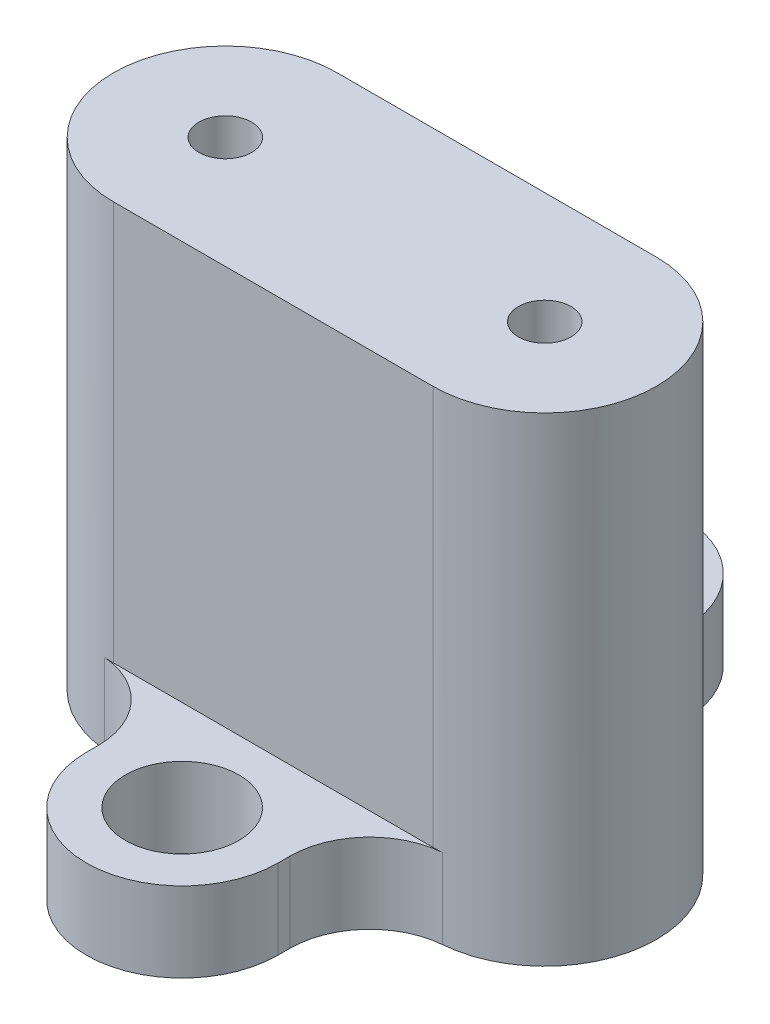
ISO-10303-21;
HEADER;
FILE_DESCRIPTION(('STEP AP214'),'2;1');
FILE_NAME('part.step','',(''),(''),'','','');
FILE_SCHEMA(('AUTOMOTIVE_DESIGN { 1 0 10303 214 1 1 1 1 }'));
ENDSEC;
DATA;
#1=APPLICATION_CONTEXT('core data for automotive mechanical design processes');
#2=APPLICATION_PROTOCOL_DEFINITION('international standard','automotive_design',2000,#1);
#3=PRODUCT_CONTEXT('',#1,'mechanical');
#4=PRODUCT('Part','Part','',(#3));
#5=PRODUCT_RELATED_PRODUCT_CATEGORY('part','',(#4));
#6=PRODUCT_DEFINITION_FORMATION('','',#4);
#7=PRODUCT_DEFINITION_CONTEXT('part definition',#1,'design');
#8=PRODUCT_DEFINITION('design','',#6,#7);
#9=PRODUCT_DEFINITION_SHAPE('','',#8);
#10=(LENGTH_UNIT() NAMED_UNIT(*) SI_UNIT(.MILLI.,.METRE.));
#11=(NAMED_UNIT(*) PLANE_ANGLE_UNIT() SI_UNIT($,.RADIAN.));
#12=(NAMED_UNIT(*) SI_UNIT($,.STERADIAN.) SOLID_ANGLE_UNIT());
#13=UNCERTAINTY_MEASURE_WITH_UNIT(LENGTH_MEASURE(1.E-05),#10,'distance_accuracy_value','');
#14=(GEOMETRIC_REPRESENTATION_CONTEXT(3) GLOBAL_UNCERTAINTY_ASSIGNED_CONTEXT((#13)) GLOBAL_UNIT_ASSIGNED_CONTEXT((#10,
#11,#12)) REPRESENTATION_CONTEXT('',''));
#15=CARTESIAN_POINT('',(0.,0.,0.));
#16=DIRECTION('',(0.,0.,1.));
#17=DIRECTION('',(1.,0.,0.));
#18=AXIS2_PLACEMENT_3D('',#15,#16,#17);
#19=CARTESIAN_POINT('',(-10.,30.,0.));
#20=DIRECTION('',(0.,-1.,0.));
#21=DIRECTION('',(0.,0.,-1.));
#22=AXIS2_PLACEMENT_3D('',#19,#20,#21);
#23=CYLINDRICAL_SURFACE('',#22,7.);
#24=CARTESIAN_POINT('',(-10.,5.,0.));
#25=DIRECTION('',(0.,-1.,0.));
#26=DIRECTION('',(0.,0.,-1.));
#27=AXIS2_PLACEMENT_3D('',#24,#25,#26);
#28=CIRCLE('',#27,7.);
#29=CARTESIAN_POINT('',(-10.,5.,-7.));
#30=VERTEX_POINT('',#29);
#31=CARTESIAN_POINT('',(-10.5833333333333,5.,-6.97565210014248));
#32=VERTEX_POINT('',#31);
#33=EDGE_CURVE('E295',#30,#32,#28,.F.);
#34=ORIENTED_EDGE('',*,*,#33,.T.);
#35=DIRECTION('',(0.,-1.,0.));
#36=VECTOR('',#35,1.);
#37=CARTESIAN_POINT('',(-10.5833333333333,30.,-6.97565210014248));
#38=LINE('',#37,#36);
#39=CARTESIAN_POINT('',(-10.5833333333333,0.,-6.97565210014248));
#40=VERTEX_POINT('',#39);
#41=EDGE_CURVE('E299',#32,#40,#38,.T.);
#42=ORIENTED_EDGE('',*,*,#41,.T.);
#43=CARTESIAN_POINT('',(-10.,0.,0.));
#44=DIRECTION('',(0.,1.,0.));
#45=DIRECTION('',(0.,0.,1.));
#46=AXIS2_PLACEMENT_3D('',#43,#44,#45);
#47=CIRCLE('',#46,7.);
#48=CARTESIAN_POINT('',(-10.5833333333333,0.,6.97565210014248));
#49=VERTEX_POINT('',#48);
#50=EDGE_CURVE('E250',#40,#49,#47,.T.);
#51=ORIENTED_EDGE('',*,*,#50,.T.);
#52=DIRECTION('',(0.,-1.,0.));
#53=VECTOR('',#52,1.);
#54=CARTESIAN_POINT('',(-10.5833333333333,30.,6.97565210014248));
#55=LINE('',#54,#53);
#56=CARTESIAN_POINT('',(-10.5833333333333,5.,6.97565210014248));
#57=VERTEX_POINT('',#56);
#58=EDGE_CURVE('E291',#49,#57,#55,.F.);
#59=ORIENTED_EDGE('',*,*,#58,.T.);
#60=CARTESIAN_POINT('',(-10.,5.,0.));
#61=DIRECTION('',(0.,-1.,0.));
#62=DIRECTION('',(0.,0.,-1.));
#63=AXIS2_PLACEMENT_3D('',#60,#61,#62);
#64=CIRCLE('',#63,7.);
#65=CARTESIAN_POINT('',(-10.,5.,7.));
#66=VERTEX_POINT('',#65);
#67=EDGE_CURVE('E287',#57,#66,#64,.F.);
#68=ORIENTED_EDGE('',*,*,#67,.T.);
#69=DIRECTION('',(0.,-1.,0.));
#70=VECTOR('',#69,1.);
#71=CARTESIAN_POINT('',(-10.,30.,7.));
#72=LINE('',#71,#70);
#73=CARTESIAN_POINT('',(-10.,30.,7.));
#74=VERTEX_POINT('',#73);
#75=EDGE_CURVE('E282',#74,#66,#72,.T.);
#76=ORIENTED_EDGE('',*,*,#75,.F.);
#77=CARTESIAN_POINT('',(-10.,30.,0.));
#78=DIRECTION('',(0.,1.,0.));
#79=DIRECTION('',(0.,0.,1.));
#80=AXIS2_PLACEMENT_3D('',#77,#78,#79);
#81=CIRCLE('',#80,7.);
#82=CARTESIAN_POINT('',(-10.,30.,-7.));
#83=VERTEX_POINT('',#82);
#84=EDGE_CURVE('E251',#83,#74,#81,.T.);
#85=ORIENTED_EDGE('',*,*,#84,.F.);
#86=DIRECTION('',(0.,-1.,0.));
#87=VECTOR('',#86,1.);
#88=CARTESIAN_POINT('',(-10.,30.,-7.));
#89=LINE('',#88,#87);
#90=EDGE_CURVE('E265',#83,#30,#89,.T.);
#91=ORIENTED_EDGE('',*,*,#90,.T.);
#92=EDGE_LOOP('',(#34,#42,#51,#59,#68,#76,#85,#91));
#93=FACE_BOUND('',#92,.T.);
#94=ADVANCED_FACE('F44',(#93),#23,.T.);
#95=CARTESIAN_POINT('',(-10.,30.,7.));
#96=DIRECTION('',(0.,0.,-1.));
#97=DIRECTION('',(-1.,0.,0.));
#98=AXIS2_PLACEMENT_3D('',#95,#96,#97);
#99=PLANE('',#98);
#100=DIRECTION('',(-1.,0.,0.));
#101=VECTOR('',#100,1.);
#102=CARTESIAN_POINT('',(-10.,5.,7.));
#103=LINE('',#102,#101);
#104=CARTESIAN_POINT('',(10.,5.,7.));
#105=VERTEX_POINT('',#104);
#106=EDGE_CURVE('E60',#105,#66,#103,.T.);
#107=ORIENTED_EDGE('',*,*,#106,.F.);
#108=DIRECTION('',(0.,-1.,0.));
#109=VECTOR('',#108,1.);
#110=CARTESIAN_POINT('',(10.,30.,7.));
#111=LINE('',#110,#109);
#112=CARTESIAN_POINT('',(10.,30.,7.));
#113=VERTEX_POINT('',#112);
#114=EDGE_CURVE('E278',#113,#105,#111,.T.);
#115=ORIENTED_EDGE('',*,*,#114,.F.);
#116=DIRECTION('',(1.,0.,0.));
#117=VECTOR('',#116,1.);
#118=CARTESIAN_POINT('',(-10.,30.,7.));
#119=LINE('',#118,#117);
#120=EDGE_CURVE('E255',#74,#113,#119,.T.);
#121=ORIENTED_EDGE('',*,*,#120,.F.);
#122=ORIENTED_EDGE('',*,*,#75,.T.);
#123=EDGE_LOOP('',(#107,#115,#121,#122));
#124=FACE_BOUND('',#123,.T.);
#125=ADVANCED_FACE('F381',(#124),#99,.F.);
#126=CARTESIAN_POINT('',(10.,30.,0.));
#127=DIRECTION('',(0.,-1.,0.));
#128=DIRECTION('',(0.,0.,-1.));
#129=AXIS2_PLACEMENT_3D('',#126,#127,#128);
#130=CYLINDRICAL_SURFACE('',#129,7.);
#131=CARTESIAN_POINT('',(10.,0.,0.));
#132=DIRECTION('',(0.,1.,0.));
#133=DIRECTION('',(0.,0.,1.));
#134=AXIS2_PLACEMENT_3D('',#131,#132,#133);
#135=CIRCLE('',#134,7.);
#136=CARTESIAN_POINT('',(10.5833333333333,0.,6.97565210014248));
#137=VERTEX_POINT('',#136);
#138=CARTESIAN_POINT('',(10.5833333333333,0.,-6.97565210014248));
#139=VERTEX_POINT('',#138);
#140=EDGE_CURVE('E256',#137,#139,#135,.T.);
#141=ORIENTED_EDGE('',*,*,#140,.T.);
#142=DIRECTION('',(0.,-1.,0.));
#143=VECTOR('',#142,1.);
#144=CARTESIAN_POINT('',(10.5833333333333,30.,-6.97565210014248));
#145=LINE('',#144,#143);
#146=CARTESIAN_POINT('',(10.5833333333333,5.,-6.97565210014248));
#147=VERTEX_POINT('',#146);
#148=EDGE_CURVE('E318',#139,#147,#145,.F.);
#149=ORIENTED_EDGE('',*,*,#148,.T.);
#150=CARTESIAN_POINT('',(10.,5.,0.));
#151=DIRECTION('',(0.,-1.,0.));
#152=DIRECTION('',(0.,0.,-1.));
#153=AXIS2_PLACEMENT_3D('',#150,#151,#152);
#154=CIRCLE('',#153,7.);
#155=CARTESIAN_POINT('',(10.,5.,-7.));
#156=VERTEX_POINT('',#155);
#157=EDGE_CURVE('E314',#147,#156,#154,.F.);
#158=ORIENTED_EDGE('',*,*,#157,.T.);
#159=DIRECTION('',(0.,-1.,0.));
#160=VECTOR('',#159,1.);
#161=CARTESIAN_POINT('',(10.,30.,-7.));
#162=LINE('',#161,#160);
#163=CARTESIAN_POINT('',(10.,30.,-7.));
#164=VERTEX_POINT('',#163);
#165=EDGE_CURVE('E275',#164,#156,#162,.T.);
#166=ORIENTED_EDGE('',*,*,#165,.F.);
#167=CARTESIAN_POINT('',(10.,30.,0.));
#168=DIRECTION('',(0.,1.,0.));
#169=DIRECTION('',(0.,0.,1.));
#170=AXIS2_PLACEMENT_3D('',#167,#168,#169);
#171=CIRCLE('',#170,7.);
#172=EDGE_CURVE('E259',#113,#164,#171,.T.);
#173=ORIENTED_EDGE('',*,*,#172,.F.);
#174=ORIENTED_EDGE('',*,*,#114,.T.);
#175=CARTESIAN_POINT('',(10.,5.,0.));
#176=DIRECTION('',(0.,-1.,0.));
#177=DIRECTION('',(0.,0.,-1.));
#178=AXIS2_PLACEMENT_3D('',#175,#176,#177);
#179=CIRCLE('',#178,7.);
#180=CARTESIAN_POINT('',(10.5833333333333,5.,6.97565210014248));
#181=VERTEX_POINT('',#180);
#182=EDGE_CURVE('E306',#105,#181,#179,.F.);
#183=ORIENTED_EDGE('',*,*,#182,.T.);
#184=DIRECTION('',(0.,-1.,0.));
#185=VECTOR('',#184,1.);
#186=CARTESIAN_POINT('',(10.5833333333333,30.,6.97565210014248));
#187=LINE('',#186,#185);
#188=EDGE_CURVE('E310',#181,#137,#187,.T.);
#189=ORIENTED_EDGE('',*,*,#188,.T.);
#190=EDGE_LOOP('',(#141,#149,#158,#166,#173,#174,#183,#189));
#191=FACE_BOUND('',#190,.T.);
#192=ADVANCED_FACE('F360',(#191),#130,.T.);
#193=CARTESIAN_POINT('',(-10.,30.,-7.));
#194=DIRECTION('',(0.,0.,1.));
#195=DIRECTION('',(1.,0.,0.));
#196=AXIS2_PLACEMENT_3D('',#193,#194,#195);
#197=PLANE('',#196);
#198=DIRECTION('',(1.,0.,0.));
#199=VECTOR('',#198,1.);
#200=CARTESIAN_POINT('',(-10.,5.,-7.));
#201=LINE('',#200,#199);
#202=EDGE_CURVE('E68',#30,#156,#201,.T.);
#203=ORIENTED_EDGE('',*,*,#202,.F.);
#204=ORIENTED_EDGE('',*,*,#90,.F.);
#205=DIRECTION('',(-1.,0.,0.));
#206=VECTOR('',#205,1.);
#207=CARTESIAN_POINT('',(-10.,30.,-7.));
#208=LINE('',#207,#206);
#209=EDGE_CURVE('E262',#164,#83,#208,.T.);
#210=ORIENTED_EDGE('',*,*,#209,.F.);
#211=ORIENTED_EDGE('',*,*,#165,.T.);
#212=EDGE_LOOP('',(#203,#204,#210,#211));
#213=FACE_BOUND('',#212,.T.);
#214=ADVANCED_FACE('F376',(#213),#197,.F.);
#215=CARTESIAN_POINT('',(-10.,30.,0.));
#216=DIRECTION('',(0.,1.,0.));
#217=DIRECTION('',(0.,0.,1.));
#218=AXIS2_PLACEMENT_3D('',#215,#216,#217);
#219=PLANE('',#218);
#220=CARTESIAN_POINT('',(-10.,30.,0.));
#221=DIRECTION('',(0.,1.,0.));
#222=DIRECTION('',(0.,0.,1.));
#223=AXIS2_PLACEMENT_3D('',#220,#221,#222);
#224=CIRCLE('',#223,1.65);
#225=CARTESIAN_POINT('',(-10.,30.,1.65));
#226=VERTEX_POINT('',#225);
#227=EDGE_CURVE('E234',#226,#226,#224,.T.);
#228=ORIENTED_EDGE('',*,*,#227,.F.);
#229=EDGE_LOOP('',(#228));
#230=FACE_BOUND('',#229,.T.);
#231=CARTESIAN_POINT('',(10.,30.,0.));
#232=DIRECTION('',(0.,1.,0.));
#233=DIRECTION('',(0.,0.,1.));
#234=AXIS2_PLACEMENT_3D('',#231,#232,#233);
#235=CIRCLE('',#234,1.65);
#236=CARTESIAN_POINT('',(10.,30.,1.65));
#237=VERTEX_POINT('',#236);
#238=EDGE_CURVE('E242',#237,#237,#235,.T.);
#239=ORIENTED_EDGE('',*,*,#238,.F.);
#240=EDGE_LOOP('',(#239));
#241=FACE_BOUND('',#240,.T.);
#242=ORIENTED_EDGE('',*,*,#84,.T.);
#243=ORIENTED_EDGE('',*,*,#120,.T.);
#244=ORIENTED_EDGE('',*,*,#172,.T.);
#245=ORIENTED_EDGE('',*,*,#209,.T.);
#246=EDGE_LOOP('',(#242,#243,#244,#245));
#247=FACE_BOUND('',#246,.T.);
#248=ADVANCED_FACE('F379',(#230,#241,#247),#219,.T.);
#249=CARTESIAN_POINT('',(-10.,0.,0.));
#250=DIRECTION('',(0.,1.,0.));
#251=DIRECTION('',(0.,0.,1.));
#252=AXIS2_PLACEMENT_3D('',#249,#250,#251);
#253=PLANE('',#252);
#254=ORIENTED_EDGE('',*,*,#50,.F.);
#255=CARTESIAN_POINT('',(-11.,0.,-11.9582607431014));
#256=DIRECTION('',(0.,1.,0.));
#257=DIRECTION('',(0.,0.,1.));
#258=AXIS2_PLACEMENT_3D('',#255,#256,#257);
#259=CIRCLE('',#258,5.);
#260=CARTESIAN_POINT('',(-5.99999999999999,0.,-11.9582607431014));
#261=VERTEX_POINT('',#260);
#262=EDGE_CURVE('E331',#40,#261,#259,.T.);
#263=ORIENTED_EDGE('',*,*,#262,.T.);
#264=DIRECTION('',(0.,0.,-1.));
#265=VECTOR('',#264,1.);
#266=CARTESIAN_POINT('',(-6.,0.,12.7));
#267=LINE('',#266,#265);
#268=CARTESIAN_POINT('',(-5.99999999999999,0.,-12.7));
#269=VERTEX_POINT('',#268);
#270=EDGE_CURVE('E216',#261,#269,#267,.T.);
#271=ORIENTED_EDGE('',*,*,#270,.T.);
#272=CARTESIAN_POINT('',(0.,0.,-12.7));
#273=DIRECTION('',(0.,-1.,0.));
#274=DIRECTION('',(0.,0.,-1.));
#275=AXIS2_PLACEMENT_3D('',#272,#273,#274);
#276=CIRCLE('',#275,6.);
#277=CARTESIAN_POINT('',(6.,0.,-12.7));
#278=VERTEX_POINT('',#277);
#279=EDGE_CURVE('E220',#269,#278,#276,.T.);
#280=ORIENTED_EDGE('',*,*,#279,.T.);
#281=DIRECTION('',(0.,0.,1.));
#282=VECTOR('',#281,1.);
#283=CARTESIAN_POINT('',(5.99999999999999,0.,12.7));
#284=LINE('',#283,#282);
#285=CARTESIAN_POINT('',(6.,0.,-11.9582607431014));
#286=VERTEX_POINT('',#285);
#287=EDGE_CURVE('E195',#278,#286,#284,.T.);
#288=ORIENTED_EDGE('',*,*,#287,.T.);
#289=CARTESIAN_POINT('',(11.,0.,-11.9582607431014));
#290=DIRECTION('',(0.,1.,0.));
#291=DIRECTION('',(0.,0.,1.));
#292=AXIS2_PLACEMENT_3D('',#289,#290,#291);
#293=CIRCLE('',#292,5.);
#294=EDGE_CURVE('E340',#286,#139,#293,.T.);
#295=ORIENTED_EDGE('',*,*,#294,.T.);
#296=ORIENTED_EDGE('',*,*,#140,.F.);
#297=CARTESIAN_POINT('',(11.,0.,11.9582607431014));
#298=DIRECTION('',(0.,1.,0.));
#299=DIRECTION('',(0.,0.,1.));
#300=AXIS2_PLACEMENT_3D('',#297,#298,#299);
#301=CIRCLE('',#300,5.);
#302=CARTESIAN_POINT('',(5.99999999999999,0.,11.9582607431014));
#303=VERTEX_POINT('',#302);
#304=EDGE_CURVE('E343',#137,#303,#301,.T.);
#305=ORIENTED_EDGE('',*,*,#304,.T.);
#306=CARTESIAN_POINT('',(5.99999999999999,0.,12.7));
#307=VERTEX_POINT('',#306);
#308=EDGE_CURVE('E200',#303,#307,#284,.T.);
#309=ORIENTED_EDGE('',*,*,#308,.T.);
#310=CARTESIAN_POINT('',(0.,0.,12.7));
#311=DIRECTION('',(0.,-1.,0.));
#312=DIRECTION('',(0.,0.,-1.));
#313=AXIS2_PLACEMENT_3D('',#310,#311,#312);
#314=CIRCLE('',#313,6.);
#315=CARTESIAN_POINT('',(-6.,0.,12.7));
#316=VERTEX_POINT('',#315);
#317=EDGE_CURVE('E213',#307,#316,#314,.T.);
#318=ORIENTED_EDGE('',*,*,#317,.T.);
#319=CARTESIAN_POINT('',(-6.,0.,11.9582607431014));
#320=VERTEX_POINT('',#319);
#321=EDGE_CURVE('E171',#316,#320,#267,.T.);
#322=ORIENTED_EDGE('',*,*,#321,.T.);
#323=CARTESIAN_POINT('',(-11.,0.,11.9582607431014));
#324=DIRECTION('',(0.,1.,0.));
#325=DIRECTION('',(0.,0.,1.));
#326=AXIS2_PLACEMENT_3D('',#323,#324,#325);
#327=CIRCLE('',#326,5.);
#328=EDGE_CURVE('E11',#320,#49,#327,.T.);
#329=ORIENTED_EDGE('',*,*,#328,.T.);
#330=EDGE_LOOP('',(#254,#263,#271,#280,#288,#295,#296,#305,#309,#318,#322,#329));
#331=FACE_BOUND('',#330,.T.);
#332=CARTESIAN_POINT('',(0.,0.,-12.7));
#333=DIRECTION('',(0.,-1.,0.));
#334=DIRECTION('',(0.,0.,-1.));
#335=AXIS2_PLACEMENT_3D('',#332,#333,#334);
#336=CIRCLE('',#335,3.556);
#337=CARTESIAN_POINT('',(0.,0.,-16.256));
#338=VERTEX_POINT('',#337);
#339=EDGE_CURVE('E396',#338,#338,#336,.T.);
#340=ORIENTED_EDGE('',*,*,#339,.F.);
#341=EDGE_LOOP('',(#340));
#342=FACE_BOUND('',#341,.T.);
#343=CARTESIAN_POINT('',(0.,0.,12.7));
#344=DIRECTION('',(0.,-1.,0.));
#345=DIRECTION('',(0.,0.,-1.));
#346=AXIS2_PLACEMENT_3D('',#343,#344,#345);
#347=CIRCLE('',#346,3.556);
#348=CARTESIAN_POINT('',(0.,0.,9.144));
#349=VERTEX_POINT('',#348);
#350=EDGE_CURVE('E203',#349,#349,#347,.T.);
#351=ORIENTED_EDGE('',*,*,#350,.F.);
#352=EDGE_LOOP('',(#351));
#353=FACE_BOUND('',#352,.T.);
#354=ADVANCED_FACE('F364',(#331,#342,#353),#253,.F.);
#355=CARTESIAN_POINT('',(10.,19.9,0.));
#356=DIRECTION('',(0.,1.,0.));
#357=DIRECTION('',(0.,0.,1.));
#358=AXIS2_PLACEMENT_3D('',#355,#356,#357);
#359=CONICAL_SURFACE('',#358,1.65,1.02974425867665);
#360=CARTESIAN_POINT('',(10.,18.9085799786045,0.));
#361=VERTEX_POINT('',#360);
#362=VERTEX_LOOP('',#361);
#363=FACE_BOUND('',#362,.T.);
#364=CARTESIAN_POINT('',(10.,19.9,0.));
#365=DIRECTION('',(0.,1.,0.));
#366=DIRECTION('',(0.,0.,1.));
#367=AXIS2_PLACEMENT_3D('',#364,#365,#366);
#368=CIRCLE('',#367,1.65);
#369=CARTESIAN_POINT('',(10.,19.9,1.65));
#370=VERTEX_POINT('',#369);
#371=EDGE_CURVE('E246',#370,#370,#368,.T.);
#372=ORIENTED_EDGE('',*,*,#371,.T.);
#373=EDGE_LOOP('',(#372));
#374=FACE_BOUND('',#373,.T.);
#375=ADVANCED_FACE('F405',(#363,#374),#359,.F.);
#376=CARTESIAN_POINT('',(10.,30.,0.));
#377=DIRECTION('',(0.,1.,0.));
#378=DIRECTION('',(0.,0.,1.));
#379=AXIS2_PLACEMENT_3D('',#376,#377,#378);
#380=CYLINDRICAL_SURFACE('',#379,1.65);
#381=ORIENTED_EDGE('',*,*,#371,.F.);
#382=EDGE_LOOP('',(#381));
#383=FACE_BOUND('',#382,.T.);
#384=ORIENTED_EDGE('',*,*,#238,.T.);
#385=EDGE_LOOP('',(#384));
#386=FACE_BOUND('',#385,.T.);
#387=ADVANCED_FACE('F551',(#383,#386),#380,.F.);
#388=CARTESIAN_POINT('',(-10.,19.9,0.));
#389=DIRECTION('',(0.,1.,0.));
#390=DIRECTION('',(0.,0.,1.));
#391=AXIS2_PLACEMENT_3D('',#388,#389,#390);
#392=CONICAL_SURFACE('',#391,1.65,1.02974425867665);
#393=CARTESIAN_POINT('',(-10.,18.9085799786045,0.));
#394=VERTEX_POINT('',#393);
#395=VERTEX_LOOP('',#394);
#396=FACE_BOUND('',#395,.T.);
#397=CARTESIAN_POINT('',(-10.,19.9,0.));
#398=DIRECTION('',(0.,1.,0.));
#399=DIRECTION('',(0.,0.,1.));
#400=AXIS2_PLACEMENT_3D('',#397,#398,#399);
#401=CIRCLE('',#400,1.65);
#402=CARTESIAN_POINT('',(-10.,19.9,1.65));
#403=VERTEX_POINT('',#402);
#404=EDGE_CURVE('E238',#403,#403,#401,.T.);
#405=ORIENTED_EDGE('',*,*,#404,.T.);
#406=EDGE_LOOP('',(#405));
#407=FACE_BOUND('',#406,.T.);
#408=ADVANCED_FACE('F560',(#396,#407),#392,.F.);
#409=CARTESIAN_POINT('',(-10.,30.,0.));
#410=DIRECTION('',(0.,1.,0.));
#411=DIRECTION('',(0.,0.,1.));
#412=AXIS2_PLACEMENT_3D('',#409,#410,#411);
#413=CYLINDRICAL_SURFACE('',#412,1.65);
#414=ORIENTED_EDGE('',*,*,#404,.F.);
#415=EDGE_LOOP('',(#414));
#416=FACE_BOUND('',#415,.T.);
#417=ORIENTED_EDGE('',*,*,#227,.T.);
#418=EDGE_LOOP('',(#417));
#419=FACE_BOUND('',#418,.T.);
#420=ADVANCED_FACE('F569',(#416,#419),#413,.F.);
#421=CARTESIAN_POINT('',(0.,5.,-12.7));
#422=DIRECTION('',(0.,-1.,0.));
#423=DIRECTION('',(0.,0.,-1.));
#424=AXIS2_PLACEMENT_3D('',#421,#422,#423);
#425=CYLINDRICAL_SURFACE('',#424,6.);
#426=ORIENTED_EDGE('',*,*,#279,.F.);
#427=DIRECTION('',(0.,-1.,0.));
#428=VECTOR('',#427,1.);
#429=CARTESIAN_POINT('',(-5.99999999999999,5.,-12.7));
#430=LINE('',#429,#428);
#431=CARTESIAN_POINT('',(-5.99999999999999,5.,-12.7));
#432=VERTEX_POINT('',#431);
#433=EDGE_CURVE('E177',#432,#269,#430,.T.);
#434=ORIENTED_EDGE('',*,*,#433,.F.);
#435=CARTESIAN_POINT('',(0.,5.,-12.7));
#436=DIRECTION('',(0.,-1.,0.));
#437=DIRECTION('',(0.,0.,-1.));
#438=AXIS2_PLACEMENT_3D('',#435,#436,#437);
#439=CIRCLE('',#438,6.);
#440=CARTESIAN_POINT('',(6.,5.,-12.7));
#441=VERTEX_POINT('',#440);
#442=EDGE_CURVE('E187',#432,#441,#439,.T.);
#443=ORIENTED_EDGE('',*,*,#442,.T.);
#444=DIRECTION('',(0.,-1.,0.));
#445=VECTOR('',#444,1.);
#446=CARTESIAN_POINT('',(6.,5.,-12.7));
#447=LINE('',#446,#445);
#448=EDGE_CURVE('E226',#441,#278,#447,.T.);
#449=ORIENTED_EDGE('',*,*,#448,.T.);
#450=EDGE_LOOP('',(#426,#434,#443,#449));
#451=FACE_BOUND('',#450,.T.);
#452=ADVANCED_FACE('F577',(#451),#425,.T.);
#453=CARTESIAN_POINT('',(0.,5.,-12.7));
#454=DIRECTION('',(0.,-1.,0.));
#455=DIRECTION('',(0.,0.,-1.));
#456=AXIS2_PLACEMENT_3D('',#453,#454,#455);
#457=CYLINDRICAL_SURFACE('',#456,3.556);
#458=CARTESIAN_POINT('',(0.,5.,-12.7));
#459=DIRECTION('',(0.,-1.,0.));
#460=DIRECTION('',(0.,0.,-1.));
#461=AXIS2_PLACEMENT_3D('',#458,#459,#460);
#462=CIRCLE('',#461,3.556);
#463=CARTESIAN_POINT('',(0.,5.,-16.256));
#464=VERTEX_POINT('',#463);
#465=EDGE_CURVE('E393',#464,#464,#462,.T.);
#466=ORIENTED_EDGE('',*,*,#465,.F.);
#467=EDGE_LOOP('',(#466));
#468=FACE_BOUND('',#467,.T.);
#469=ORIENTED_EDGE('',*,*,#339,.T.);
#470=EDGE_LOOP('',(#469));
#471=FACE_BOUND('',#470,.T.);
#472=ADVANCED_FACE('F402',(#468,#471),#457,.F.);
#473=CARTESIAN_POINT('',(0.,5.,12.7));
#474=DIRECTION('',(0.,-1.,0.));
#475=DIRECTION('',(0.,0.,-1.));
#476=AXIS2_PLACEMENT_3D('',#473,#474,#475);
#477=PLANE('',#476);
#478=ORIENTED_EDGE('',*,*,#465,.T.);
#479=EDGE_LOOP('',(#478));
#480=FACE_BOUND('',#479,.T.);
#481=DIRECTION('',(0.,0.,-1.));
#482=VECTOR('',#481,1.);
#483=CARTESIAN_POINT('',(-6.,5.,12.7));
#484=LINE('',#483,#482);
#485=CARTESIAN_POINT('',(-5.99999999999999,5.,-11.9582607431014));
#486=VERTEX_POINT('',#485);
#487=EDGE_CURVE('E188',#486,#432,#484,.T.);
#488=ORIENTED_EDGE('',*,*,#487,.F.);
#489=CARTESIAN_POINT('',(-11.,5.,-11.9582607431014));
#490=DIRECTION('',(0.,-1.,0.));
#491=DIRECTION('',(0.,0.,-1.));
#492=AXIS2_PLACEMENT_3D('',#489,#490,#491);
#493=CIRCLE('',#492,5.);
#494=EDGE_CURVE('E334',#486,#32,#493,.T.);
#495=ORIENTED_EDGE('',*,*,#494,.T.);
#496=ORIENTED_EDGE('',*,*,#33,.F.);
#497=ORIENTED_EDGE('',*,*,#202,.T.);
#498=ORIENTED_EDGE('',*,*,#157,.F.);
#499=CARTESIAN_POINT('',(11.,5.,-11.9582607431014));
#500=DIRECTION('',(0.,-1.,0.));
#501=DIRECTION('',(0.,0.,-1.));
#502=AXIS2_PLACEMENT_3D('',#499,#500,#501);
#503=CIRCLE('',#502,5.);
#504=CARTESIAN_POINT('',(6.,5.,-11.9582607431014));
#505=VERTEX_POINT('',#504);
#506=EDGE_CURVE('E337',#147,#505,#503,.T.);
#507=ORIENTED_EDGE('',*,*,#506,.T.);
#508=DIRECTION('',(0.,0.,1.));
#509=VECTOR('',#508,1.);
#510=CARTESIAN_POINT('',(5.99999999999999,5.,12.7));
#511=LINE('',#510,#509);
#512=EDGE_CURVE('E178',#441,#505,#511,.T.);
#513=ORIENTED_EDGE('',*,*,#512,.F.);
#514=ORIENTED_EDGE('',*,*,#442,.F.);
#515=EDGE_LOOP('',(#488,#495,#496,#497,#498,#507,#513,#514));
#516=FACE_BOUND('',#515,.T.);
#517=ADVANCED_FACE('F479',(#480,#516),#477,.F.);
#518=CARTESIAN_POINT('',(-6.,5.,12.7));
#519=DIRECTION('',(-1.,0.,0.));
#520=DIRECTION('',(0.,0.,1.));
#521=AXIS2_PLACEMENT_3D('',#518,#519,#520);
#522=PLANE('',#521);
#523=ORIENTED_EDGE('',*,*,#270,.F.);
#524=DIRECTION('',(0.,-1.,0.));
#525=VECTOR('',#524,1.);
#526=CARTESIAN_POINT('',(-5.99999999999999,5.,-11.9582607431014));
#527=LINE('',#526,#525);
#528=EDGE_CURVE('E303',#261,#486,#527,.F.);
#529=ORIENTED_EDGE('',*,*,#528,.T.);
#530=ORIENTED_EDGE('',*,*,#487,.T.);
#531=ORIENTED_EDGE('',*,*,#433,.T.);
#532=EDGE_LOOP('',(#523,#529,#530,#531));
#533=FACE_BOUND('',#532,.T.);
#534=ADVANCED_FACE('F465',(#533),#522,.T.);
#535=CARTESIAN_POINT('',(5.99999999999999,5.,12.7));
#536=DIRECTION('',(1.,0.,0.));
#537=DIRECTION('',(0.,0.,-1.));
#538=AXIS2_PLACEMENT_3D('',#535,#536,#537);
#539=PLANE('',#538);
#540=ORIENTED_EDGE('',*,*,#512,.T.);
#541=DIRECTION('',(0.,-1.,0.));
#542=VECTOR('',#541,1.);
#543=CARTESIAN_POINT('',(6.,5.,-11.9582607431014));
#544=LINE('',#543,#542);
#545=EDGE_CURVE('E322',#505,#286,#544,.T.);
#546=ORIENTED_EDGE('',*,*,#545,.T.);
#547=ORIENTED_EDGE('',*,*,#287,.F.);
#548=ORIENTED_EDGE('',*,*,#448,.F.);
#549=EDGE_LOOP('',(#540,#546,#547,#548));
#550=FACE_BOUND('',#549,.T.);
#551=ADVANCED_FACE('F472',(#550),#539,.T.);
#552=CARTESIAN_POINT('',(0.,5.,12.7));
#553=DIRECTION('',(0.,-1.,0.));
#554=DIRECTION('',(0.,0.,-1.));
#555=AXIS2_PLACEMENT_3D('',#552,#553,#554);
#556=CIRCLE('',#555,3.556);
#557=CARTESIAN_POINT('',(0.,5.,9.144));
#558=VERTEX_POINT('',#557);
#559=EDGE_CURVE('E217',#558,#558,#556,.T.);
#560=ORIENTED_EDGE('',*,*,#559,.T.);
#561=EDGE_LOOP('',(#560));
#562=FACE_BOUND('',#561,.T.);
#563=CARTESIAN_POINT('',(5.99999999999999,5.,11.9582607431014));
#564=VERTEX_POINT('',#563);
#565=CARTESIAN_POINT('',(5.99999999999999,5.,12.7));
#566=VERTEX_POINT('',#565);
#567=EDGE_CURVE('E209',#564,#566,#511,.T.);
#568=ORIENTED_EDGE('',*,*,#567,.F.);
#569=CARTESIAN_POINT('',(11.,5.,11.9582607431014));
#570=DIRECTION('',(0.,-1.,0.));
#571=DIRECTION('',(0.,0.,-1.));
#572=AXIS2_PLACEMENT_3D('',#569,#570,#571);
#573=CIRCLE('',#572,5.);
#574=EDGE_CURVE('E346',#564,#181,#573,.T.);
#575=ORIENTED_EDGE('',*,*,#574,.T.);
#576=ORIENTED_EDGE('',*,*,#182,.F.);
#577=ORIENTED_EDGE('',*,*,#106,.T.);
#578=ORIENTED_EDGE('',*,*,#67,.F.);
#579=CARTESIAN_POINT('',(-11.,5.,11.9582607431014));
#580=DIRECTION('',(0.,-1.,0.));
#581=DIRECTION('',(0.,0.,-1.));
#582=AXIS2_PLACEMENT_3D('',#579,#580,#581);
#583=CIRCLE('',#582,5.);
#584=CARTESIAN_POINT('',(-6.,5.,11.9582607431014));
#585=VERTEX_POINT('',#584);
#586=EDGE_CURVE('E53',#57,#585,#583,.T.);
#587=ORIENTED_EDGE('',*,*,#586,.T.);
#588=CARTESIAN_POINT('',(-6.,5.,12.7));
#589=VERTEX_POINT('',#588);
#590=EDGE_CURVE('E168',#589,#585,#484,.T.);
#591=ORIENTED_EDGE('',*,*,#590,.F.);
#592=CARTESIAN_POINT('',(0.,5.,12.7));
#593=DIRECTION('',(0.,-1.,0.));
#594=DIRECTION('',(0.,0.,-1.));
#595=AXIS2_PLACEMENT_3D('',#592,#593,#594);
#596=CIRCLE('',#595,6.);
#597=EDGE_CURVE('E184',#566,#589,#596,.T.);
#598=ORIENTED_EDGE('',*,*,#597,.F.);
#599=EDGE_LOOP('',(#568,#575,#576,#577,#578,#587,#591,#598));
#600=FACE_BOUND('',#599,.T.);
#601=ADVANCED_FACE('F183',(#562,#600),#477,.F.);
#602=ORIENTED_EDGE('',*,*,#308,.F.);
#603=DIRECTION('',(0.,-1.,0.));
#604=VECTOR('',#603,1.);
#605=CARTESIAN_POINT('',(5.99999999999999,5.,11.9582607431014));
#606=LINE('',#605,#604);
#607=EDGE_CURVE('E325',#303,#564,#606,.F.);
#608=ORIENTED_EDGE('',*,*,#607,.T.);
#609=ORIENTED_EDGE('',*,*,#567,.T.);
#610=DIRECTION('',(0.,-1.,0.));
#611=VECTOR('',#610,1.);
#612=CARTESIAN_POINT('',(5.99999999999999,5.,12.7));
#613=LINE('',#612,#611);
#614=EDGE_CURVE('E193',#566,#307,#613,.T.);
#615=ORIENTED_EDGE('',*,*,#614,.T.);
#616=EDGE_LOOP('',(#602,#608,#609,#615));
#617=FACE_BOUND('',#616,.T.);
#618=ADVANCED_FACE('F352',(#617),#539,.T.);
#619=ORIENTED_EDGE('',*,*,#590,.T.);
#620=DIRECTION('',(0.,-1.,0.));
#621=VECTOR('',#620,1.);
#622=CARTESIAN_POINT('',(-6.,5.,11.9582607431014));
#623=LINE('',#622,#621);
#624=EDGE_CURVE('E328',#585,#320,#623,.T.);
#625=ORIENTED_EDGE('',*,*,#624,.T.);
#626=ORIENTED_EDGE('',*,*,#321,.F.);
#627=DIRECTION('',(0.,-1.,0.));
#628=VECTOR('',#627,1.);
#629=CARTESIAN_POINT('',(-6.,5.,12.7));
#630=LINE('',#629,#628);
#631=EDGE_CURVE('E165',#589,#316,#630,.T.);
#632=ORIENTED_EDGE('',*,*,#631,.F.);
#633=EDGE_LOOP('',(#619,#625,#626,#632));
#634=FACE_BOUND('',#633,.T.);
#635=ADVANCED_FACE('F167',(#634),#522,.T.);
#636=CARTESIAN_POINT('',(0.,5.,12.7));
#637=DIRECTION('',(0.,-1.,0.));
#638=DIRECTION('',(0.,0.,-1.));
#639=AXIS2_PLACEMENT_3D('',#636,#637,#638);
#640=CYLINDRICAL_SURFACE('',#639,6.);
#641=ORIENTED_EDGE('',*,*,#317,.F.);
#642=ORIENTED_EDGE('',*,*,#614,.F.);
#643=ORIENTED_EDGE('',*,*,#597,.T.);
#644=ORIENTED_EDGE('',*,*,#631,.T.);
#645=EDGE_LOOP('',(#641,#642,#643,#644));
#646=FACE_BOUND('',#645,.T.);
#647=ADVANCED_FACE('F191',(#646),#640,.T.);
#648=CARTESIAN_POINT('',(0.,5.,12.7));
#649=DIRECTION('',(0.,-1.,0.));
#650=DIRECTION('',(0.,0.,-1.));
#651=AXIS2_PLACEMENT_3D('',#648,#649,#650);
#652=CYLINDRICAL_SURFACE('',#651,3.556);
#653=ORIENTED_EDGE('',*,*,#559,.F.);
#654=EDGE_LOOP('',(#653));
#655=FACE_BOUND('',#654,.T.);
#656=ORIENTED_EDGE('',*,*,#350,.T.);
#657=EDGE_LOOP('',(#656));
#658=FACE_BOUND('',#657,.T.);
#659=ADVANCED_FACE('F409',(#655,#658),#652,.F.);
#660=CARTESIAN_POINT('',(-11.,30.,-11.9582607431014));
#661=DIRECTION('',(0.,-1.,0.));
#662=DIRECTION('',(0.,0.,-1.));
#663=AXIS2_PLACEMENT_3D('',#660,#661,#662);
#664=CYLINDRICAL_SURFACE('',#663,5.);
#665=ORIENTED_EDGE('',*,*,#494,.F.);
#666=ORIENTED_EDGE('',*,*,#528,.F.);
#667=ORIENTED_EDGE('',*,*,#262,.F.);
#668=ORIENTED_EDGE('',*,*,#41,.F.);
#669=EDGE_LOOP('',(#665,#666,#667,#668));
#670=FACE_BOUND('',#669,.T.);
#671=ADVANCED_FACE('F411',(#670),#664,.F.);
#672=CARTESIAN_POINT('',(11.,30.,-11.9582607431014));
#673=DIRECTION('',(0.,-1.,0.));
#674=DIRECTION('',(0.,0.,-1.));
#675=AXIS2_PLACEMENT_3D('',#672,#673,#674);
#676=CYLINDRICAL_SURFACE('',#675,5.);
#677=ORIENTED_EDGE('',*,*,#294,.F.);
#678=ORIENTED_EDGE('',*,*,#545,.F.);
#679=ORIENTED_EDGE('',*,*,#506,.F.);
#680=ORIENTED_EDGE('',*,*,#148,.F.);
#681=EDGE_LOOP('',(#677,#678,#679,#680));
#682=FACE_BOUND('',#681,.T.);
#683=ADVANCED_FACE('F370',(#682),#676,.F.);
#684=CARTESIAN_POINT('',(11.,30.,11.9582607431014));
#685=DIRECTION('',(0.,-1.,0.));
#686=DIRECTION('',(0.,0.,-1.));
#687=AXIS2_PLACEMENT_3D('',#684,#685,#686);
#688=CYLINDRICAL_SURFACE('',#687,5.);
#689=ORIENTED_EDGE('',*,*,#574,.F.);
#690=ORIENTED_EDGE('',*,*,#607,.F.);
#691=ORIENTED_EDGE('',*,*,#304,.F.);
#692=ORIENTED_EDGE('',*,*,#188,.F.);
#693=EDGE_LOOP('',(#689,#690,#691,#692));
#694=FACE_BOUND('',#693,.T.);
#695=ADVANCED_FACE('F357',(#694),#688,.F.);
#696=CARTESIAN_POINT('',(-11.,30.,11.9582607431014));
#697=DIRECTION('',(0.,-1.,0.));
#698=DIRECTION('',(0.,0.,-1.));
#699=AXIS2_PLACEMENT_3D('',#696,#697,#698);
#700=CYLINDRICAL_SURFACE('',#699,5.);
#701=ORIENTED_EDGE('',*,*,#328,.F.);
#702=ORIENTED_EDGE('',*,*,#624,.F.);
#703=ORIENTED_EDGE('',*,*,#586,.F.);
#704=ORIENTED_EDGE('',*,*,#58,.F.);
#705=EDGE_LOOP('',(#701,#702,#703,#704));
#706=FACE_BOUND('',#705,.T.);
#707=ADVANCED_FACE('F46',(#706),#700,.F.);
#708=CLOSED_SHELL('',(#94,#125,#192,#214,#248,#354,#375,#387,#408,#420,#452,#472,#517,#534,#551,
#601,#618,#635,#647,#659,#671,#683,#695,#707));
#709=MANIFOLD_SOLID_BREP('B2',#708);
#710=ADVANCED_BREP_SHAPE_REPRESENTATION('',(#18,#709),#14);
#711=SHAPE_DEFINITION_REPRESENTATION(#9,#710);
ENDSEC;
END-ISO-10303-21;
